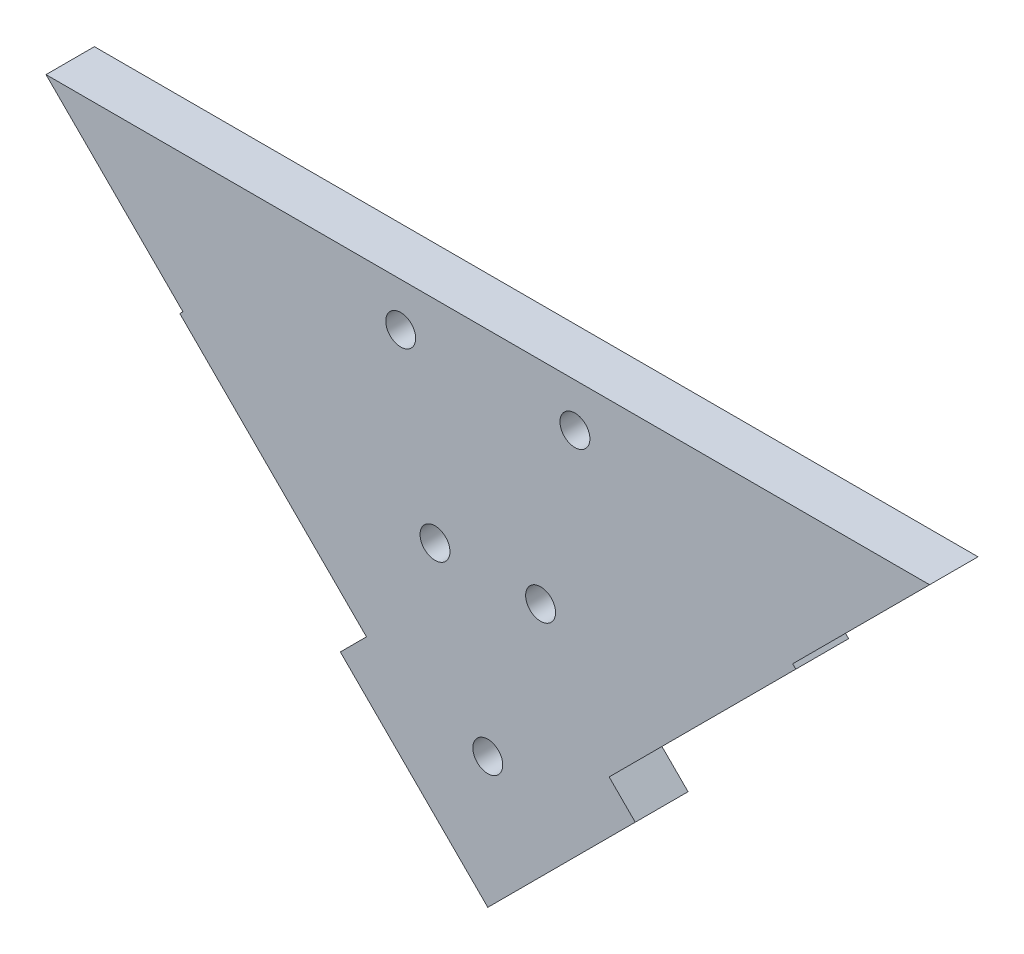
ISO-10303-21;
HEADER;
FILE_DESCRIPTION(('STEP AP214'),'2;1');
FILE_NAME('part.step','',(''),(''),'','','');
FILE_SCHEMA(('AUTOMOTIVE_DESIGN { 1 0 10303 214 1 1 1 1 }'));
ENDSEC;
DATA;
#1=APPLICATION_CONTEXT('core data for automotive mechanical design processes');
#2=APPLICATION_PROTOCOL_DEFINITION('international standard','automotive_design',2000,#1);
#3=PRODUCT_CONTEXT('',#1,'mechanical');
#4=PRODUCT('Part','Part','',(#3));
#5=PRODUCT_RELATED_PRODUCT_CATEGORY('part','',(#4));
#6=PRODUCT_DEFINITION_FORMATION('','',#4);
#7=PRODUCT_DEFINITION_CONTEXT('part definition',#1,'design');
#8=PRODUCT_DEFINITION('design','',#6,#7);
#9=PRODUCT_DEFINITION_SHAPE('','',#8);
#10=(LENGTH_UNIT() NAMED_UNIT(*) SI_UNIT(.MILLI.,.METRE.));
#11=(NAMED_UNIT(*) PLANE_ANGLE_UNIT() SI_UNIT($,.RADIAN.));
#12=(NAMED_UNIT(*) SI_UNIT($,.STERADIAN.) SOLID_ANGLE_UNIT());
#13=UNCERTAINTY_MEASURE_WITH_UNIT(LENGTH_MEASURE(1.E-05),#10,'distance_accuracy_value','');
#14=(GEOMETRIC_REPRESENTATION_CONTEXT(3) GLOBAL_UNCERTAINTY_ASSIGNED_CONTEXT((#13)) GLOBAL_UNIT_ASSIGNED_CONTEXT((#10,
#11,#12)) REPRESENTATION_CONTEXT('',''));
#15=CARTESIAN_POINT('',(0.,0.,0.));
#16=DIRECTION('',(0.,0.,1.));
#17=DIRECTION('',(1.,0.,0.));
#18=AXIS2_PLACEMENT_3D('',#15,#16,#17);
#19=CARTESIAN_POINT('',(0.,0.,67.));
#20=DIRECTION('',(0.,0.,1.));
#21=DIRECTION('',(1.,0.,0.));
#22=AXIS2_PLACEMENT_3D('',#19,#20,#21);
#23=PLANE('',#22);
#24=CARTESIAN_POINT('',(9.899494936612,-74.95331880577,67.));
#25=DIRECTION('',(0.,0.,1.));
#26=DIRECTION('',(1.,0.,0.));
#27=AXIS2_PLACEMENT_3D('',#24,#25,#26);
#28=CIRCLE('',#27,1.7);
#29=CARTESIAN_POINT('',(11.599494936612,-74.95331880577,67.));
#30=VERTEX_POINT('',#29);
#31=EDGE_CURVE('E25',#30,#30,#28,.T.);
#32=ORIENTED_EDGE('',*,*,#31,.T.);
#33=EDGE_LOOP('',(#32));
#34=FACE_BOUND('',#33,.T.);
#35=CARTESIAN_POINT('',(-9.899494936612,-74.95331880577,67.));
#36=DIRECTION('',(0.,0.,1.));
#37=DIRECTION('',(1.,0.,0.));
#38=AXIS2_PLACEMENT_3D('',#35,#36,#37);
#39=CIRCLE('',#38,1.7);
#40=CARTESIAN_POINT('',(-8.199494936612,-74.95331880577,67.));
#41=VERTEX_POINT('',#40);
#42=EDGE_CURVE('E192',#41,#41,#39,.T.);
#43=ORIENTED_EDGE('',*,*,#42,.T.);
#44=EDGE_LOOP('',(#43));
#45=FACE_BOUND('',#44,.T.);
#46=CARTESIAN_POINT('',(6.,-94.,67.));
#47=DIRECTION('',(0.,0.,1.));
#48=DIRECTION('',(1.,0.,0.));
#49=AXIS2_PLACEMENT_3D('',#46,#47,#48);
#50=CIRCLE('',#49,1.7);
#51=CARTESIAN_POINT('',(7.7,-94.,67.));
#52=VERTEX_POINT('',#51);
#53=EDGE_CURVE('E193',#52,#52,#50,.T.);
#54=ORIENTED_EDGE('',*,*,#53,.T.);
#55=EDGE_LOOP('',(#54));
#56=FACE_BOUND('',#55,.T.);
#57=CARTESIAN_POINT('',(0.,-112.,67.));
#58=DIRECTION('',(0.,0.,1.));
#59=DIRECTION('',(1.,0.,0.));
#60=AXIS2_PLACEMENT_3D('',#57,#58,#59);
#61=CIRCLE('',#60,1.7);
#62=CARTESIAN_POINT('',(1.7,-112.,67.));
#63=VERTEX_POINT('',#62);
#64=EDGE_CURVE('E212',#63,#63,#61,.T.);
#65=ORIENTED_EDGE('',*,*,#64,.T.);
#66=EDGE_LOOP('',(#65));
#67=FACE_BOUND('',#66,.T.);
#68=CARTESIAN_POINT('',(-6.,-94.,67.));
#69=DIRECTION('',(0.,0.,1.));
#70=DIRECTION('',(1.,0.,0.));
#71=AXIS2_PLACEMENT_3D('',#68,#69,#70);
#72=CIRCLE('',#71,1.7);
#73=CARTESIAN_POINT('',(-4.3,-94.,67.));
#74=VERTEX_POINT('',#73);
#75=EDGE_CURVE('E255',#74,#74,#72,.T.);
#76=ORIENTED_EDGE('',*,*,#75,.T.);
#77=EDGE_LOOP('',(#76));
#78=FACE_BOUND('',#77,.T.);
#79=DIRECTION('',(0.707106781186548,0.707106781186548,0.));
#80=VECTOR('',#79,1.);
#81=CARTESIAN_POINT('',(47.376154339499,-72.83199846221,67.));
#82=LINE('',#81,#80);
#83=CARTESIAN_POINT('',(34.648232278141,-85.55992052357,67.));
#84=VERTEX_POINT('',#83);
#85=CARTESIAN_POINT('',(49.708152801713,-70.5,67.));
#86=VERTEX_POINT('',#85);
#87=EDGE_CURVE('E226',#84,#86,#82,.T.);
#88=ORIENTED_EDGE('',*,*,#87,.F.);
#89=DIRECTION('',(-0.707106781186548,0.707106781186548,0.));
#90=VECTOR('',#89,1.);
#91=CARTESIAN_POINT('',(4.596194077713,-55.50788232314,67.));
#92=LINE('',#91,#90);
#93=CARTESIAN_POINT('',(35.001785668736,-85.91347391416,67.));
#94=VERTEX_POINT('',#93);
#95=EDGE_CURVE('E178',#94,#84,#92,.T.);
#96=ORIENTED_EDGE('',*,*,#95,.F.);
#97=DIRECTION('',(-0.707106781186548,-0.707106781186548,0.));
#98=VECTOR('',#97,1.);
#99=CARTESIAN_POINT('',(49.851028073652,-71.06423150924,67.));
#100=LINE('',#99,#98);
#101=CARTESIAN_POINT('',(13.788582233138,-107.1266773497,67.));
#102=VERTEX_POINT('',#101);
#103=EDGE_CURVE('E250',#94,#102,#100,.T.);
#104=ORIENTED_EDGE('',*,*,#103,.T.);
#105=DIRECTION('',(0.707106781186548,-0.707106781186548,0.));
#106=VECTOR('',#105,1.);
#107=CARTESIAN_POINT('',(-8.131727983645,-85.20636713297,67.));
#108=LINE('',#107,#106);
#109=CARTESIAN_POINT('',(16.758430714121,-110.0965258307,67.));
#110=VERTEX_POINT('',#109);
#111=EDGE_CURVE('E186',#102,#110,#108,.T.);
#112=ORIENTED_EDGE('',*,*,#111,.T.);
#113=DIRECTION('',(-0.707106781186548,-0.707106781186548,0.));
#114=VECTOR('',#113,1.);
#115=CARTESIAN_POINT('',(40.092954493277,-86.76200205158,67.));
#116=LINE('',#115,#114);
#117=CARTESIAN_POINT('',(-1.101341240428E-13,-126.8549565448,67.));
#118=VERTEX_POINT('',#117);
#119=EDGE_CURVE('E269',#110,#118,#116,.T.);
#120=ORIENTED_EDGE('',*,*,#119,.T.);
#121=DIRECTION('',(-0.707106781186548,0.707106781186548,0.));
#122=VECTOR('',#121,1.);
#123=CARTESIAN_POINT('',(-29.62777413171,-97.22718241315,67.));
#124=LINE('',#123,#122);
#125=CARTESIAN_POINT('',(-16.75843071412,-110.0965258307,67.));
#126=VERTEX_POINT('',#125);
#127=EDGE_CURVE('E270',#118,#126,#124,.T.);
#128=ORIENTED_EDGE('',*,*,#127,.T.);
#129=DIRECTION('',(-0.707106781186548,-0.707106781186548,0.));
#130=VECTOR('',#129,1.);
#131=CARTESIAN_POINT('',(8.131727983645,-85.20636713297,67.));
#132=LINE('',#131,#130);
#133=CARTESIAN_POINT('',(-13.78858223313,-107.1266773497,67.));
#134=VERTEX_POINT('',#133);
#135=EDGE_CURVE('E278',#134,#126,#132,.T.);
#136=ORIENTED_EDGE('',*,*,#135,.F.);
#137=DIRECTION('',(-0.707106781186548,0.707106781186548,0.));
#138=VECTOR('',#137,1.);
#139=CARTESIAN_POINT('',(-37.12310601229,-83.7921535706,67.));
#140=LINE('',#139,#138);
#141=CARTESIAN_POINT('',(-35.00178566873,-85.91347391416,67.));
#142=VERTEX_POINT('',#141);
#143=EDGE_CURVE('E181',#134,#142,#140,.T.);
#144=ORIENTED_EDGE('',*,*,#143,.T.);
#145=DIRECTION('',(0.707106781186548,0.707106781186548,0.));
#146=VECTOR('',#145,1.);
#147=CARTESIAN_POINT('',(-4.596194077713,-55.50788232314,67.));
#148=LINE('',#147,#146);
#149=CARTESIAN_POINT('',(-34.64823227814,-85.55992052357,67.));
#150=VERTEX_POINT('',#149);
#151=EDGE_CURVE('E146',#142,#150,#148,.T.);
#152=ORIENTED_EDGE('',*,*,#151,.T.);
#153=DIRECTION('',(0.707106781186548,-0.707106781186548,0.));
#154=VECTOR('',#153,1.);
#155=CARTESIAN_POINT('',(-72.83199846221,-47.37615433949,67.));
#156=LINE('',#155,#154);
#157=CARTESIAN_POINT('',(-49.70815280171,-70.5,67.));
#158=VERTEX_POINT('',#157);
#159=EDGE_CURVE('E296',#158,#150,#156,.T.);
#160=ORIENTED_EDGE('',*,*,#159,.F.);
#161=DIRECTION('',(1.,0.,0.));
#162=VECTOR('',#161,1.);
#163=CARTESIAN_POINT('',(-71.,-70.5,67.));
#164=LINE('',#163,#162);
#165=EDGE_CURVE('E9',#158,#86,#164,.T.);
#166=ORIENTED_EDGE('',*,*,#165,.T.);
#167=EDGE_LOOP('',(#88,#96,#104,#112,#120,#128,#136,#144,#152,#160,#166));
#168=FACE_BOUND('',#167,.T.);
#169=ADVANCED_FACE('F14',(#34,#45,#56,#67,#78,#168),#23,.F.);
#170=CARTESIAN_POINT('',(-71.,-70.5,67.));
#171=DIRECTION('',(0.,-0.707106781186548,0.707106781186548));
#172=DIRECTION('',(-1.,0.,0.));
#173=AXIS2_PLACEMENT_3D('',#170,#171,#172);
#174=PLANE('',#173);
#175=DIRECTION('',(-0.577350269189626,-0.577350269189626,-0.577350269189626));
#176=VECTOR('',#175,1.);
#177=CARTESIAN_POINT('',(21.23682049357,-98.97133230814,38.528667691857));
#178=LINE('',#177,#176);
#179=CARTESIAN_POINT('',(50.208152801713,-70.,67.5));
#180=VERTEX_POINT('',#179);
#181=EDGE_CURVE('E233',#180,#86,#178,.T.);
#182=ORIENTED_EDGE('',*,*,#181,.T.);
#183=ORIENTED_EDGE('',*,*,#165,.F.);
#184=DIRECTION('',(-0.577350269189626,0.577350269189626,0.577350269189626));
#185=VECTOR('',#184,1.);
#186=CARTESIAN_POINT('',(-61.87404990871,-58.33410289299,79.165897107001));
#187=LINE('',#186,#185);
#188=CARTESIAN_POINT('',(-50.20815280171,-70.,67.5));
#189=VERTEX_POINT('',#188);
#190=EDGE_CURVE('E291',#158,#189,#187,.T.);
#191=ORIENTED_EDGE('',*,*,#190,.T.);
#192=DIRECTION('',(1.,0.,0.));
#193=VECTOR('',#192,1.);
#194=CARTESIAN_POINT('',(-71.,-70.,67.5));
#195=LINE('',#194,#193);
#196=EDGE_CURVE('E260',#189,#180,#195,.T.);
#197=ORIENTED_EDGE('',*,*,#196,.T.);
#198=EDGE_LOOP('',(#182,#183,#191,#197));
#199=FACE_BOUND('',#198,.T.);
#200=ADVANCED_FACE('F532',(#199),#174,.F.);
#201=CARTESIAN_POINT('',(9.899494936612,-74.95331880577,47.));
#202=DIRECTION('',(0.,0.,1.));
#203=DIRECTION('',(1.,0.,0.));
#204=AXIS2_PLACEMENT_3D('',#201,#202,#203);
#205=CYLINDRICAL_SURFACE('',#204,1.7);
#206=DIRECTION('',(0.,0.,1.));
#207=VECTOR('',#206,1.);
#208=CARTESIAN_POINT('',(11.599494936612,-74.95331880577,47.));
#209=LINE('',#208,#207);
#210=CARTESIAN_POINT('',(11.599494936612,-74.95331880577,73.));
#211=VERTEX_POINT('',#210);
#212=EDGE_CURVE('E202',#30,#211,#209,.T.);
#213=ORIENTED_EDGE('',*,*,#212,.F.);
#214=ORIENTED_EDGE('',*,*,#31,.F.);
#215=ORIENTED_EDGE('',*,*,#212,.T.);
#216=CARTESIAN_POINT('',(9.899494936612,-74.95331880577,73.));
#217=DIRECTION('',(0.,0.,1.));
#218=DIRECTION('',(1.,0.,0.));
#219=AXIS2_PLACEMENT_3D('',#216,#217,#218);
#220=CIRCLE('',#219,1.7);
#221=EDGE_CURVE('E245',#211,#211,#220,.T.);
#222=ORIENTED_EDGE('',*,*,#221,.T.);
#223=EDGE_LOOP('',(#213,#214,#215,#222));
#224=FACE_BOUND('',#223,.T.);
#225=ADVANCED_FACE('F498',(#224),#205,.F.);
#226=CARTESIAN_POINT('',(-9.899494936612,-74.95331880577,47.));
#227=DIRECTION('',(0.,0.,1.));
#228=DIRECTION('',(1.,0.,0.));
#229=AXIS2_PLACEMENT_3D('',#226,#227,#228);
#230=CYLINDRICAL_SURFACE('',#229,1.7);
#231=DIRECTION('',(0.,0.,1.));
#232=VECTOR('',#231,1.);
#233=CARTESIAN_POINT('',(-8.199494936612,-74.95331880577,47.));
#234=LINE('',#233,#232);
#235=CARTESIAN_POINT('',(-8.199494936612,-74.95331880577,73.));
#236=VERTEX_POINT('',#235);
#237=EDGE_CURVE('E190',#41,#236,#234,.T.);
#238=ORIENTED_EDGE('',*,*,#237,.F.);
#239=ORIENTED_EDGE('',*,*,#42,.F.);
#240=ORIENTED_EDGE('',*,*,#237,.T.);
#241=CARTESIAN_POINT('',(-9.899494936612,-74.95331880577,73.));
#242=DIRECTION('',(0.,0.,1.));
#243=DIRECTION('',(1.,0.,0.));
#244=AXIS2_PLACEMENT_3D('',#241,#242,#243);
#245=CIRCLE('',#244,1.7);
#246=EDGE_CURVE('E242',#236,#236,#245,.T.);
#247=ORIENTED_EDGE('',*,*,#246,.T.);
#248=EDGE_LOOP('',(#238,#239,#240,#247));
#249=FACE_BOUND('',#248,.T.);
#250=ADVANCED_FACE('F16',(#249),#230,.F.);
#251=CARTESIAN_POINT('',(6.,-94.,60.));
#252=DIRECTION('',(0.,0.,1.));
#253=DIRECTION('',(1.,0.,0.));
#254=AXIS2_PLACEMENT_3D('',#251,#252,#253);
#255=CYLINDRICAL_SURFACE('',#254,1.7);
#256=DIRECTION('',(0.,0.,1.));
#257=VECTOR('',#256,1.);
#258=CARTESIAN_POINT('',(7.7,-94.,60.));
#259=LINE('',#258,#257);
#260=CARTESIAN_POINT('',(7.7,-94.,73.));
#261=VERTEX_POINT('',#260);
#262=EDGE_CURVE('E204',#52,#261,#259,.T.);
#263=ORIENTED_EDGE('',*,*,#262,.F.);
#264=ORIENTED_EDGE('',*,*,#53,.F.);
#265=ORIENTED_EDGE('',*,*,#262,.T.);
#266=CARTESIAN_POINT('',(6.,-94.,73.));
#267=DIRECTION('',(0.,0.,1.));
#268=DIRECTION('',(1.,0.,0.));
#269=AXIS2_PLACEMENT_3D('',#266,#267,#268);
#270=CIRCLE('',#269,1.7);
#271=EDGE_CURVE('E246',#261,#261,#270,.T.);
#272=ORIENTED_EDGE('',*,*,#271,.T.);
#273=EDGE_LOOP('',(#263,#264,#265,#272));
#274=FACE_BOUND('',#273,.T.);
#275=ADVANCED_FACE('F497',(#274),#255,.F.);
#276=CARTESIAN_POINT('',(0.,-112.,47.));
#277=DIRECTION('',(0.,0.,1.));
#278=DIRECTION('',(1.,0.,0.));
#279=AXIS2_PLACEMENT_3D('',#276,#277,#278);
#280=CYLINDRICAL_SURFACE('',#279,1.7);
#281=DIRECTION('',(0.,0.,1.));
#282=VECTOR('',#281,1.);
#283=CARTESIAN_POINT('',(1.7,-112.,47.));
#284=LINE('',#283,#282);
#285=CARTESIAN_POINT('',(1.7,-112.,73.));
#286=VERTEX_POINT('',#285);
#287=EDGE_CURVE('E240',#63,#286,#284,.T.);
#288=ORIENTED_EDGE('',*,*,#287,.F.);
#289=ORIENTED_EDGE('',*,*,#64,.F.);
#290=ORIENTED_EDGE('',*,*,#287,.T.);
#291=CARTESIAN_POINT('',(0.,-112.,73.));
#292=DIRECTION('',(0.,0.,1.));
#293=DIRECTION('',(1.,0.,0.));
#294=AXIS2_PLACEMENT_3D('',#291,#292,#293);
#295=CIRCLE('',#294,1.7);
#296=EDGE_CURVE('E18',#286,#286,#295,.T.);
#297=ORIENTED_EDGE('',*,*,#296,.T.);
#298=EDGE_LOOP('',(#288,#289,#290,#297));
#299=FACE_BOUND('',#298,.T.);
#300=ADVANCED_FACE('F591',(#299),#280,.F.);
#301=CARTESIAN_POINT('',(-6.,-94.,60.));
#302=DIRECTION('',(0.,0.,1.));
#303=DIRECTION('',(1.,0.,0.));
#304=AXIS2_PLACEMENT_3D('',#301,#302,#303);
#305=CYLINDRICAL_SURFACE('',#304,1.7);
#306=DIRECTION('',(0.,0.,1.));
#307=VECTOR('',#306,1.);
#308=CARTESIAN_POINT('',(-4.3,-94.,60.));
#309=LINE('',#308,#307);
#310=CARTESIAN_POINT('',(-4.3,-94.,73.));
#311=VERTEX_POINT('',#310);
#312=EDGE_CURVE('E259',#74,#311,#309,.T.);
#313=ORIENTED_EDGE('',*,*,#312,.F.);
#314=ORIENTED_EDGE('',*,*,#75,.F.);
#315=ORIENTED_EDGE('',*,*,#312,.T.);
#316=CARTESIAN_POINT('',(-6.,-94.,73.));
#317=DIRECTION('',(0.,0.,1.));
#318=DIRECTION('',(1.,0.,0.));
#319=AXIS2_PLACEMENT_3D('',#316,#317,#318);
#320=CIRCLE('',#319,1.7);
#321=EDGE_CURVE('E221',#311,#311,#320,.T.);
#322=ORIENTED_EDGE('',*,*,#321,.T.);
#323=EDGE_LOOP('',(#313,#314,#315,#322));
#324=FACE_BOUND('',#323,.T.);
#325=ADVANCED_FACE('F369',(#324),#305,.F.);
#326=CARTESIAN_POINT('',(16.758430714121,-110.0965258307,60.));
#327=DIRECTION('',(-0.707106781186548,0.707106781186548,0.));
#328=DIRECTION('',(0.,0.,1.));
#329=AXIS2_PLACEMENT_3D('',#326,#327,#328);
#330=PLANE('',#329);
#331=DIRECTION('',(-0.707106781186548,-0.707106781186548,0.));
#332=VECTOR('',#331,1.);
#333=CARTESIAN_POINT('',(40.092954493277,-86.76200205158,73.));
#334=LINE('',#333,#332);
#335=CARTESIAN_POINT('',(16.758430714121,-110.0965258307,73.));
#336=VERTEX_POINT('',#335);
#337=CARTESIAN_POINT('',(-1.101341240428E-13,-126.8549565448,73.));
#338=VERTEX_POINT('',#337);
#339=EDGE_CURVE('E234',#336,#338,#334,.T.);
#340=ORIENTED_EDGE('',*,*,#339,.T.);
#341=DIRECTION('',(0.,0.,1.));
#342=VECTOR('',#341,1.);
#343=CARTESIAN_POINT('',(-1.016964290557E-13,-126.8549565448,60.));
#344=LINE('',#343,#342);
#345=EDGE_CURVE('E266',#118,#338,#344,.T.);
#346=ORIENTED_EDGE('',*,*,#345,.F.);
#347=ORIENTED_EDGE('',*,*,#119,.F.);
#348=DIRECTION('',(0.,0.,1.));
#349=VECTOR('',#348,1.);
#350=CARTESIAN_POINT('',(16.758430714121,-110.0965258307,60.));
#351=LINE('',#350,#349);
#352=EDGE_CURVE('E182',#110,#336,#351,.T.);
#353=ORIENTED_EDGE('',*,*,#352,.T.);
#354=EDGE_LOOP('',(#340,#346,#347,#353));
#355=FACE_BOUND('',#354,.T.);
#356=ADVANCED_FACE('F348',(#355),#330,.F.);
#357=CARTESIAN_POINT('',(4.171930009001,-131.0268865538,60.));
#358=DIRECTION('',(0.707106781186548,0.707106781186548,0.));
#359=DIRECTION('',(0.,0.,-1.));
#360=AXIS2_PLACEMENT_3D('',#357,#358,#359);
#361=PLANE('',#360);
#362=DIRECTION('',(-0.707106781186548,0.707106781186548,0.));
#363=VECTOR('',#362,1.);
#364=CARTESIAN_POINT('',(-29.62777413171,-97.22718241315,73.));
#365=LINE('',#364,#363);
#366=CARTESIAN_POINT('',(-16.75843071412,-110.0965258307,73.));
#367=VERTEX_POINT('',#366);
#368=EDGE_CURVE('E229',#338,#367,#365,.T.);
#369=ORIENTED_EDGE('',*,*,#368,.T.);
#370=DIRECTION('',(0.,0.,1.));
#371=VECTOR('',#370,1.);
#372=CARTESIAN_POINT('',(-16.75843071412,-110.0965258307,60.));
#373=LINE('',#372,#371);
#374=EDGE_CURVE('E187',#126,#367,#373,.T.);
#375=ORIENTED_EDGE('',*,*,#374,.F.);
#376=ORIENTED_EDGE('',*,*,#127,.F.);
#377=ORIENTED_EDGE('',*,*,#345,.T.);
#378=EDGE_LOOP('',(#369,#375,#376,#377));
#379=FACE_BOUND('',#378,.T.);
#380=ADVANCED_FACE('F572',(#379),#361,.F.);
#381=CARTESIAN_POINT('',(30.405591591021,-123.7436867076,60.));
#382=DIRECTION('',(-0.707106781186548,-0.707106781186548,0.));
#383=DIRECTION('',(-0.707106781186548,0.707106781186548,0.));
#384=AXIS2_PLACEMENT_3D('',#381,#382,#383);
#385=PLANE('',#384);
#386=DIRECTION('',(0.,0.,1.));
#387=VECTOR('',#386,1.);
#388=CARTESIAN_POINT('',(13.788582233138,-107.1266773497,60.));
#389=LINE('',#388,#387);
#390=CARTESIAN_POINT('',(13.788582233138,-107.1266773497,73.));
#391=VERTEX_POINT('',#390);
#392=EDGE_CURVE('E254',#102,#391,#389,.T.);
#393=ORIENTED_EDGE('',*,*,#392,.T.);
#394=DIRECTION('',(0.707106781186548,-0.707106781186548,0.));
#395=VECTOR('',#394,1.);
#396=CARTESIAN_POINT('',(-8.131727983645,-85.20636713297,73.));
#397=LINE('',#396,#395);
#398=EDGE_CURVE('E238',#391,#336,#397,.T.);
#399=ORIENTED_EDGE('',*,*,#398,.T.);
#400=ORIENTED_EDGE('',*,*,#352,.F.);
#401=ORIENTED_EDGE('',*,*,#111,.F.);
#402=EDGE_LOOP('',(#393,#399,#400,#401));
#403=FACE_BOUND('',#402,.T.);
#404=ADVANCED_FACE('F346',(#403),#385,.F.);
#405=CARTESIAN_POINT('',(-30.40559159102,-123.7436867076,60.));
#406=DIRECTION('',(-0.707106781186548,0.707106781186548,0.));
#407=DIRECTION('',(0.,0.,1.));
#408=AXIS2_PLACEMENT_3D('',#405,#406,#407);
#409=PLANE('',#408);
#410=ORIENTED_EDGE('',*,*,#135,.T.);
#411=ORIENTED_EDGE('',*,*,#374,.T.);
#412=DIRECTION('',(-0.707106781186548,-0.707106781186548,0.));
#413=VECTOR('',#412,1.);
#414=CARTESIAN_POINT('',(8.131727983645,-85.20636713297,73.));
#415=LINE('',#414,#413);
#416=CARTESIAN_POINT('',(-13.78858223313,-107.1266773497,73.));
#417=VERTEX_POINT('',#416);
#418=EDGE_CURVE('E161',#417,#367,#415,.T.);
#419=ORIENTED_EDGE('',*,*,#418,.F.);
#420=DIRECTION('',(0.,0.,1.));
#421=VECTOR('',#420,1.);
#422=CARTESIAN_POINT('',(-13.78858223313,-107.1266773497,60.));
#423=LINE('',#422,#421);
#424=EDGE_CURVE('E156',#134,#417,#423,.T.);
#425=ORIENTED_EDGE('',*,*,#424,.F.);
#426=EDGE_LOOP('',(#410,#411,#419,#425));
#427=FACE_BOUND('',#426,.T.);
#428=ADVANCED_FACE('F559',(#427),#409,.T.);
#429=CARTESIAN_POINT('',(39.244426355853,-81.67083322704,60.));
#430=DIRECTION('',(-0.707106781186548,0.707106781186548,0.));
#431=DIRECTION('',(0.,0.,1.));
#432=AXIS2_PLACEMENT_3D('',#429,#430,#431);
#433=PLANE('',#432);
#434=ORIENTED_EDGE('',*,*,#103,.F.);
#435=DIRECTION('',(0.,0.,1.));
#436=VECTOR('',#435,1.);
#437=CARTESIAN_POINT('',(35.001785668735,-85.91347391416,53.5));
#438=LINE('',#437,#436);
#439=CARTESIAN_POINT('',(35.001785668736,-85.91347391416,73.));
#440=VERTEX_POINT('',#439);
#441=EDGE_CURVE('E150',#94,#440,#438,.T.);
#442=ORIENTED_EDGE('',*,*,#441,.T.);
#443=DIRECTION('',(-0.707106781186548,-0.707106781186548,0.));
#444=VECTOR('',#443,1.);
#445=CARTESIAN_POINT('',(49.851028073652,-71.06423150924,73.));
#446=LINE('',#445,#444);
#447=EDGE_CURVE('E308',#440,#391,#446,.T.);
#448=ORIENTED_EDGE('',*,*,#447,.T.);
#449=ORIENTED_EDGE('',*,*,#392,.F.);
#450=EDGE_LOOP('',(#434,#442,#448,#449));
#451=FACE_BOUND('',#450,.T.);
#452=ADVANCED_FACE('F555',(#451),#433,.F.);
#453=CARTESIAN_POINT('',(-13.78858223313,-107.1266773497,60.));
#454=DIRECTION('',(0.707106781186548,0.707106781186548,0.));
#455=DIRECTION('',(0.,0.,-1.));
#456=AXIS2_PLACEMENT_3D('',#453,#454,#455);
#457=PLANE('',#456);
#458=DIRECTION('',(-0.707106781186548,0.707106781186548,0.));
#459=VECTOR('',#458,1.);
#460=CARTESIAN_POINT('',(-37.12310601229,-83.7921535706,73.));
#461=LINE('',#460,#459);
#462=CARTESIAN_POINT('',(-35.00178566873,-85.91347391416,73.));
#463=VERTEX_POINT('',#462);
#464=EDGE_CURVE('E153',#417,#463,#461,.T.);
#465=ORIENTED_EDGE('',*,*,#464,.T.);
#466=DIRECTION('',(0.,0.,1.));
#467=VECTOR('',#466,1.);
#468=CARTESIAN_POINT('',(-35.00178566873,-85.91347391416,53.5));
#469=LINE('',#468,#467);
#470=EDGE_CURVE('E138',#142,#463,#469,.T.);
#471=ORIENTED_EDGE('',*,*,#470,.F.);
#472=ORIENTED_EDGE('',*,*,#143,.F.);
#473=ORIENTED_EDGE('',*,*,#424,.T.);
#474=EDGE_LOOP('',(#465,#471,#472,#473));
#475=FACE_BOUND('',#474,.T.);
#476=ADVANCED_FACE('F154',(#475),#457,.F.);
#477=CARTESIAN_POINT('',(34.648232278141,-85.55992052357,47.));
#478=DIRECTION('',(0.707106781186548,0.707106781186548,0.));
#479=DIRECTION('',(0.,0.,-1.));
#480=AXIS2_PLACEMENT_3D('',#477,#478,#479);
#481=PLANE('',#480);
#482=DIRECTION('',(-0.707106781186548,0.707106781186548,0.));
#483=VECTOR('',#482,1.);
#484=CARTESIAN_POINT('',(4.596194077713,-55.50788232314,73.));
#485=LINE('',#484,#483);
#486=CARTESIAN_POINT('',(34.648232278141,-85.55992052357,73.));
#487=VERTEX_POINT('',#486);
#488=EDGE_CURVE('E222',#440,#487,#485,.T.);
#489=ORIENTED_EDGE('',*,*,#488,.F.);
#490=ORIENTED_EDGE('',*,*,#441,.F.);
#491=ORIENTED_EDGE('',*,*,#95,.T.);
#492=DIRECTION('',(0.,0.,1.));
#493=VECTOR('',#492,1.);
#494=CARTESIAN_POINT('',(34.648232278141,-85.55992052357,47.));
#495=LINE('',#494,#493);
#496=EDGE_CURVE('E223',#84,#487,#495,.T.);
#497=ORIENTED_EDGE('',*,*,#496,.T.);
#498=EDGE_LOOP('',(#489,#490,#491,#497));
#499=FACE_BOUND('',#498,.T.);
#500=ADVANCED_FACE('F502',(#499),#481,.T.);
#501=CARTESIAN_POINT('',(-34.64823227814,-85.55992052357,47.));
#502=DIRECTION('',(0.707106781186548,-0.707106781186548,0.));
#503=DIRECTION('',(0.,0.,-1.));
#504=AXIS2_PLACEMENT_3D('',#501,#502,#503);
#505=PLANE('',#504);
#506=DIRECTION('',(0.,0.,1.));
#507=VECTOR('',#506,1.);
#508=CARTESIAN_POINT('',(-34.64823227814,-85.55992052357,47.));
#509=LINE('',#508,#507);
#510=CARTESIAN_POINT('',(-34.64823227814,-85.55992052357,73.));
#511=VERTEX_POINT('',#510);
#512=EDGE_CURVE('E216',#150,#511,#509,.T.);
#513=ORIENTED_EDGE('',*,*,#512,.F.);
#514=ORIENTED_EDGE('',*,*,#151,.F.);
#515=ORIENTED_EDGE('',*,*,#470,.T.);
#516=DIRECTION('',(0.707106781186548,0.707106781186548,0.));
#517=VECTOR('',#516,1.);
#518=CARTESIAN_POINT('',(-4.596194077713,-55.50788232314,73.));
#519=LINE('',#518,#517);
#520=EDGE_CURVE('E143',#463,#511,#519,.T.);
#521=ORIENTED_EDGE('',*,*,#520,.T.);
#522=EDGE_LOOP('',(#513,#514,#515,#521));
#523=FACE_BOUND('',#522,.T.);
#524=ADVANCED_FACE('F141',(#523),#505,.F.);
#525=CARTESIAN_POINT('',(34.648232278141,-85.55992052357,47.));
#526=DIRECTION('',(0.707106781186548,-0.707106781186548,0.));
#527=DIRECTION('',(0.,0.,-1.));
#528=AXIS2_PLACEMENT_3D('',#525,#526,#527);
#529=PLANE('',#528);
#530=ORIENTED_EDGE('',*,*,#496,.F.);
#531=ORIENTED_EDGE('',*,*,#87,.T.);
#532=ORIENTED_EDGE('',*,*,#181,.F.);
#533=DIRECTION('',(0.,0.,-1.));
#534=VECTOR('',#533,1.);
#535=CARTESIAN_POINT('',(50.208152801713,-70.,56.5));
#536=LINE('',#535,#534);
#537=CARTESIAN_POINT('',(50.208152801713,-70.,73.));
#538=VERTEX_POINT('',#537);
#539=EDGE_CURVE('E265',#538,#180,#536,.T.);
#540=ORIENTED_EDGE('',*,*,#539,.F.);
#541=DIRECTION('',(0.707106781186548,0.707106781186548,0.));
#542=VECTOR('',#541,1.);
#543=CARTESIAN_POINT('',(47.376154339499,-72.83199846221,73.));
#544=LINE('',#543,#542);
#545=EDGE_CURVE('E217',#487,#538,#544,.T.);
#546=ORIENTED_EDGE('',*,*,#545,.F.);
#547=EDGE_LOOP('',(#530,#531,#532,#540,#546));
#548=FACE_BOUND('',#547,.T.);
#549=ADVANCED_FACE('F385',(#548),#529,.T.);
#550=CARTESIAN_POINT('',(-85.55992052357,-34.64823227814,47.));
#551=DIRECTION('',(-0.707106781186548,-0.707106781186548,0.));
#552=DIRECTION('',(-0.707106781186548,0.707106781186548,0.));
#553=AXIS2_PLACEMENT_3D('',#550,#551,#552);
#554=PLANE('',#553);
#555=DIRECTION('',(0.,0.,1.));
#556=VECTOR('',#555,1.);
#557=CARTESIAN_POINT('',(-50.20815280171,-70.,56.5));
#558=LINE('',#557,#556);
#559=CARTESIAN_POINT('',(-50.20815280171,-70.,73.));
#560=VERTEX_POINT('',#559);
#561=EDGE_CURVE('E264',#189,#560,#558,.T.);
#562=ORIENTED_EDGE('',*,*,#561,.F.);
#563=ORIENTED_EDGE('',*,*,#190,.F.);
#564=ORIENTED_EDGE('',*,*,#159,.T.);
#565=ORIENTED_EDGE('',*,*,#512,.T.);
#566=DIRECTION('',(0.707106781186548,-0.707106781186548,0.));
#567=VECTOR('',#566,1.);
#568=CARTESIAN_POINT('',(-72.83199846221,-47.37615433949,73.));
#569=LINE('',#568,#567);
#570=EDGE_CURVE('E166',#560,#511,#569,.T.);
#571=ORIENTED_EDGE('',*,*,#570,.F.);
#572=EDGE_LOOP('',(#562,#563,#564,#565,#571));
#573=FACE_BOUND('',#572,.T.);
#574=ADVANCED_FACE('F393',(#573),#554,.T.);
#575=CARTESIAN_POINT('',(70.,-70.,66.));
#576=DIRECTION('',(0.,-1.,0.));
#577=DIRECTION('',(-1.,0.,0.));
#578=AXIS2_PLACEMENT_3D('',#575,#576,#577);
#579=PLANE('',#578);
#580=ORIENTED_EDGE('',*,*,#539,.T.);
#581=ORIENTED_EDGE('',*,*,#196,.F.);
#582=ORIENTED_EDGE('',*,*,#561,.T.);
#583=DIRECTION('',(1.,0.,0.));
#584=VECTOR('',#583,1.);
#585=CARTESIAN_POINT('',(35.,-70.,73.));
#586=LINE('',#585,#584);
#587=EDGE_CURVE('E173',#560,#538,#586,.T.);
#588=ORIENTED_EDGE('',*,*,#587,.T.);
#589=EDGE_LOOP('',(#580,#581,#582,#588));
#590=FACE_BOUND('',#589,.T.);
#591=ADVANCED_FACE('F389',(#590),#579,.F.);
#592=CARTESIAN_POINT('',(0.,0.,73.));
#593=DIRECTION('',(0.,0.,1.));
#594=DIRECTION('',(1.,0.,0.));
#595=AXIS2_PLACEMENT_3D('',#592,#593,#594);
#596=PLANE('',#595);
#597=ORIENTED_EDGE('',*,*,#221,.F.);
#598=EDGE_LOOP('',(#597));
#599=FACE_BOUND('',#598,.T.);
#600=ORIENTED_EDGE('',*,*,#246,.F.);
#601=EDGE_LOOP('',(#600));
#602=FACE_BOUND('',#601,.T.);
#603=ORIENTED_EDGE('',*,*,#271,.F.);
#604=EDGE_LOOP('',(#603));
#605=FACE_BOUND('',#604,.T.);
#606=ORIENTED_EDGE('',*,*,#296,.F.);
#607=EDGE_LOOP('',(#606));
#608=FACE_BOUND('',#607,.T.);
#609=ORIENTED_EDGE('',*,*,#321,.F.);
#610=EDGE_LOOP('',(#609));
#611=FACE_BOUND('',#610,.T.);
#612=ORIENTED_EDGE('',*,*,#587,.F.);
#613=ORIENTED_EDGE('',*,*,#570,.T.);
#614=ORIENTED_EDGE('',*,*,#520,.F.);
#615=ORIENTED_EDGE('',*,*,#464,.F.);
#616=ORIENTED_EDGE('',*,*,#418,.T.);
#617=ORIENTED_EDGE('',*,*,#368,.F.);
#618=ORIENTED_EDGE('',*,*,#339,.F.);
#619=ORIENTED_EDGE('',*,*,#398,.F.);
#620=ORIENTED_EDGE('',*,*,#447,.F.);
#621=ORIENTED_EDGE('',*,*,#488,.T.);
#622=ORIENTED_EDGE('',*,*,#545,.T.);
#623=EDGE_LOOP('',(#612,#613,#614,#615,#616,#617,#618,#619,#620,#621,#622));
#624=FACE_BOUND('',#623,.T.);
#625=ADVANCED_FACE('F164',(#599,#602,#605,#608,#611,#624),#596,.T.);
#626=CLOSED_SHELL('',(#169,#200,#225,#250,#275,#300,#325,#356,#380,#404,#428,#452,#476,#500,
#524,#549,#574,#591,#625));
#627=MANIFOLD_SOLID_BREP('B1',#626);
#628=ADVANCED_BREP_SHAPE_REPRESENTATION('',(#18,#627),#14);
#629=SHAPE_DEFINITION_REPRESENTATION(#9,#628);
ENDSEC;
END-ISO-10303-21;
